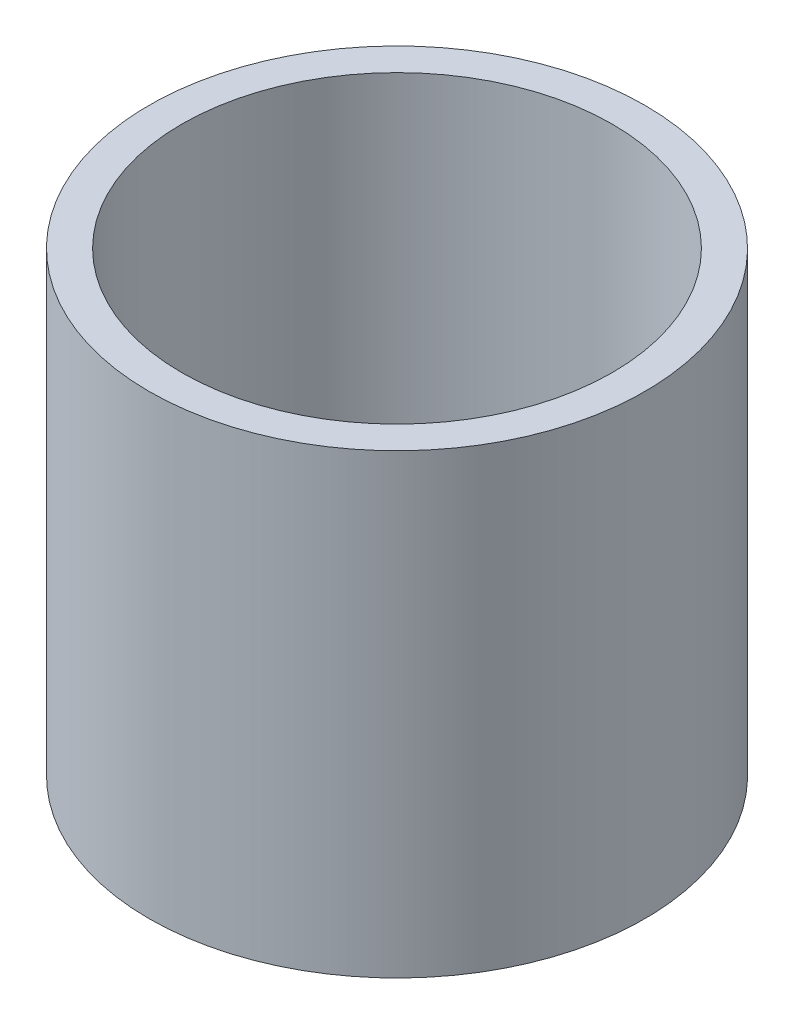
ISO-10303-21;
HEADER;
FILE_DESCRIPTION(('STEP AP214'),'2;1');
FILE_NAME('part.step','',(''),(''),'','','');
FILE_SCHEMA(('AUTOMOTIVE_DESIGN { 1 0 10303 214 1 1 1 1 }'));
ENDSEC;
DATA;
#1=APPLICATION_CONTEXT('core data for automotive mechanical design processes');
#2=APPLICATION_PROTOCOL_DEFINITION('international standard','automotive_design',2000,#1);
#3=PRODUCT_CONTEXT('',#1,'mechanical');
#4=PRODUCT('Part','Part','',(#3));
#5=PRODUCT_RELATED_PRODUCT_CATEGORY('part','',(#4));
#6=PRODUCT_DEFINITION_FORMATION('','',#4);
#7=PRODUCT_DEFINITION_CONTEXT('part definition',#1,'design');
#8=PRODUCT_DEFINITION('design','',#6,#7);
#9=PRODUCT_DEFINITION_SHAPE('','',#8);
#10=(LENGTH_UNIT() NAMED_UNIT(*) SI_UNIT(.MILLI.,.METRE.));
#11=(NAMED_UNIT(*) PLANE_ANGLE_UNIT() SI_UNIT($,.RADIAN.));
#12=(NAMED_UNIT(*) SI_UNIT($,.STERADIAN.) SOLID_ANGLE_UNIT());
#13=UNCERTAINTY_MEASURE_WITH_UNIT(LENGTH_MEASURE(1.E-05),#10,'distance_accuracy_value','');
#14=(GEOMETRIC_REPRESENTATION_CONTEXT(3) GLOBAL_UNCERTAINTY_ASSIGNED_CONTEXT((#13)) GLOBAL_UNIT_ASSIGNED_CONTEXT((#10,
#11,#12)) REPRESENTATION_CONTEXT('',''));
#15=CARTESIAN_POINT('',(0.,0.,0.));
#16=DIRECTION('',(0.,0.,1.));
#17=DIRECTION('',(1.,0.,0.));
#18=AXIS2_PLACEMENT_3D('',#15,#16,#17);
#19=CARTESIAN_POINT('',(0.,5.,0.));
#20=DIRECTION('',(0.,-1.,0.));
#21=DIRECTION('',(0.,0.,-1.));
#22=AXIS2_PLACEMENT_3D('',#19,#20,#21);
#23=CYLINDRICAL_SURFACE('',#22,19.);
#24=CARTESIAN_POINT('',(0.,0.,0.));
#25=DIRECTION('',(0.,1.,0.));
#26=DIRECTION('',(0.,0.,1.));
#27=AXIS2_PLACEMENT_3D('',#24,#25,#26);
#28=CIRCLE('',#27,19.);
#29=CARTESIAN_POINT('',(0.,0.,19.));
#30=VERTEX_POINT('',#29);
#31=EDGE_CURVE('E39',#30,#30,#28,.T.);
#32=ORIENTED_EDGE('',*,*,#31,.T.);
#33=EDGE_LOOP('',(#32));
#34=FACE_BOUND('',#33,.T.);
#35=CARTESIAN_POINT('',(0.,35.,0.));
#36=DIRECTION('',(0.,1.,0.));
#37=DIRECTION('',(0.,0.,1.));
#38=AXIS2_PLACEMENT_3D('',#35,#36,#37);
#39=CIRCLE('',#38,19.);
#40=CARTESIAN_POINT('',(0.,35.,19.));
#41=VERTEX_POINT('',#40);
#42=EDGE_CURVE('E43',#41,#41,#39,.T.);
#43=ORIENTED_EDGE('',*,*,#42,.F.);
#44=EDGE_LOOP('',(#43));
#45=FACE_BOUND('',#44,.T.);
#46=ADVANCED_FACE('F33',(#34,#45),#23,.T.);
#47=CARTESIAN_POINT('',(0.,0.,0.));
#48=DIRECTION('',(0.,1.,0.));
#49=DIRECTION('',(0.,0.,1.));
#50=AXIS2_PLACEMENT_3D('',#47,#48,#49);
#51=PLANE('',#50);
#52=ORIENTED_EDGE('',*,*,#31,.F.);
#53=EDGE_LOOP('',(#52));
#54=FACE_BOUND('',#53,.T.);
#55=ADVANCED_FACE('F57',(#54),#51,.F.);
#56=CARTESIAN_POINT('',(0.,35.,0.));
#57=DIRECTION('',(0.,1.,0.));
#58=DIRECTION('',(0.,0.,1.));
#59=AXIS2_PLACEMENT_3D('',#56,#57,#58);
#60=PLANE('',#59);
#61=ORIENTED_EDGE('',*,*,#42,.T.);
#62=EDGE_LOOP('',(#61));
#63=FACE_BOUND('',#62,.T.);
#64=CARTESIAN_POINT('',(0.,35.,0.));
#65=DIRECTION('',(0.,1.,0.));
#66=DIRECTION('',(0.,0.,1.));
#67=AXIS2_PLACEMENT_3D('',#64,#65,#66);
#68=CIRCLE('',#67,16.5);
#69=CARTESIAN_POINT('',(0.,35.,16.5));
#70=VERTEX_POINT('',#69);
#71=EDGE_CURVE('E47',#70,#70,#68,.T.);
#72=ORIENTED_EDGE('',*,*,#71,.F.);
#73=EDGE_LOOP('',(#72));
#74=FACE_BOUND('',#73,.T.);
#75=ADVANCED_FACE('F55',(#63,#74),#60,.T.);
#76=CARTESIAN_POINT('',(0.,35.,0.));
#77=DIRECTION('',(0.,-1.,0.));
#78=DIRECTION('',(0.,0.,-1.));
#79=AXIS2_PLACEMENT_3D('',#76,#77,#78);
#80=CYLINDRICAL_SURFACE('',#79,16.5);
#81=ORIENTED_EDGE('',*,*,#71,.T.);
#82=EDGE_LOOP('',(#81));
#83=FACE_BOUND('',#82,.T.);
#84=CARTESIAN_POINT('',(0.,5.,0.));
#85=DIRECTION('',(0.,1.,0.));
#86=DIRECTION('',(0.,0.,1.));
#87=AXIS2_PLACEMENT_3D('',#84,#85,#86);
#88=CIRCLE('',#87,16.5);
#89=CARTESIAN_POINT('',(0.,5.,16.5));
#90=VERTEX_POINT('',#89);
#91=EDGE_CURVE('E10',#90,#90,#88,.F.);
#92=ORIENTED_EDGE('',*,*,#91,.T.);
#93=EDGE_LOOP('',(#92));
#94=FACE_BOUND('',#93,.T.);
#95=ADVANCED_FACE('F53',(#83,#94),#80,.F.);
#96=CARTESIAN_POINT('',(0.,5.,0.));
#97=DIRECTION('',(0.,1.,0.));
#98=DIRECTION('',(0.,0.,1.));
#99=AXIS2_PLACEMENT_3D('',#96,#97,#98);
#100=PLANE('',#99);
#101=ORIENTED_EDGE('',*,*,#91,.F.);
#102=EDGE_LOOP('',(#101));
#103=FACE_BOUND('',#102,.T.);
#104=ADVANCED_FACE('F64',(#103),#100,.T.);
#105=CLOSED_SHELL('',(#46,#55,#75,#95,#104));
#106=MANIFOLD_SOLID_BREP('B2',#105);
#107=ADVANCED_BREP_SHAPE_REPRESENTATION('',(#18,#106),#14);
#108=SHAPE_DEFINITION_REPRESENTATION(#9,#107);
ENDSEC;
END-ISO-10303-21;
